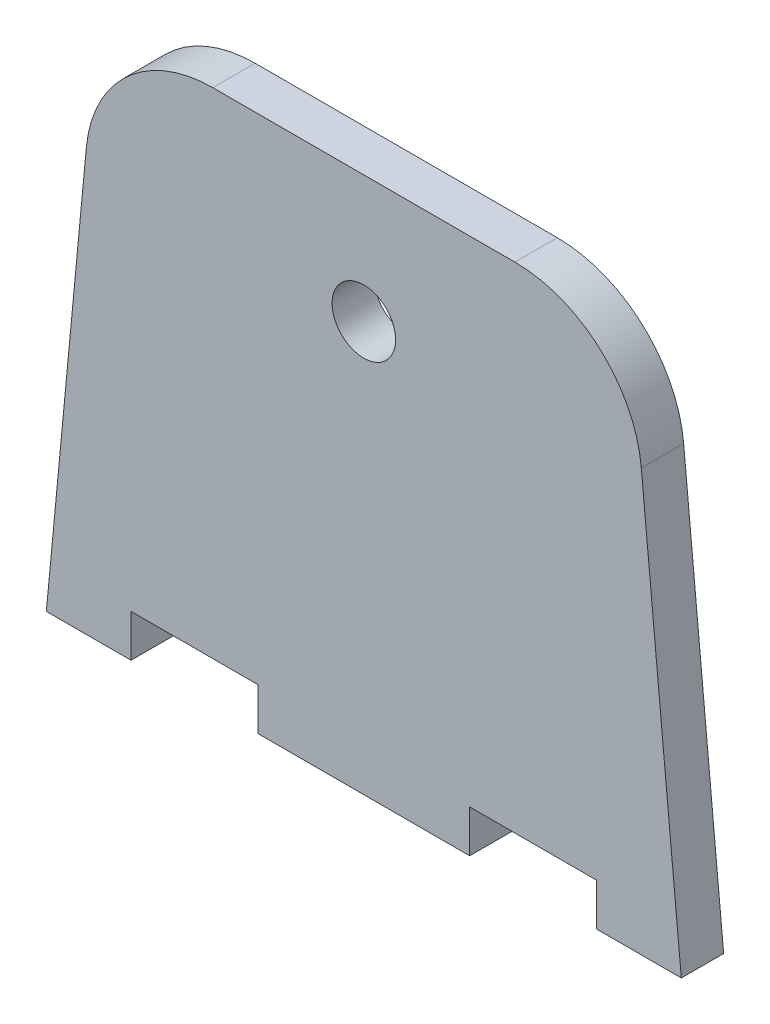
ISO-10303-21;
HEADER;
FILE_DESCRIPTION(('STEP AP214'),'2;1');
FILE_NAME('part.step','',(''),(''),'','','');
FILE_SCHEMA(('AUTOMOTIVE_DESIGN { 1 0 10303 214 1 1 1 1 }'));
ENDSEC;
DATA;
#1=APPLICATION_CONTEXT('core data for automotive mechanical design processes');
#2=APPLICATION_PROTOCOL_DEFINITION('international standard','automotive_design',2000,#1);
#3=PRODUCT_CONTEXT('',#1,'mechanical');
#4=PRODUCT('Part','Part','',(#3));
#5=PRODUCT_RELATED_PRODUCT_CATEGORY('part','',(#4));
#6=PRODUCT_DEFINITION_FORMATION('','',#4);
#7=PRODUCT_DEFINITION_CONTEXT('part definition',#1,'design');
#8=PRODUCT_DEFINITION('design','',#6,#7);
#9=PRODUCT_DEFINITION_SHAPE('','',#8);
#10=(LENGTH_UNIT() NAMED_UNIT(*) SI_UNIT(.MILLI.,.METRE.));
#11=(NAMED_UNIT(*) PLANE_ANGLE_UNIT() SI_UNIT($,.RADIAN.));
#12=(NAMED_UNIT(*) SI_UNIT($,.STERADIAN.) SOLID_ANGLE_UNIT());
#13=UNCERTAINTY_MEASURE_WITH_UNIT(LENGTH_MEASURE(1.E-05),#10,'distance_accuracy_value','');
#14=(GEOMETRIC_REPRESENTATION_CONTEXT(3) GLOBAL_UNCERTAINTY_ASSIGNED_CONTEXT((#13)) GLOBAL_UNIT_ASSIGNED_CONTEXT((#10,
#11,#12)) REPRESENTATION_CONTEXT('',''));
#15=CARTESIAN_POINT('',(0.,0.,0.));
#16=DIRECTION('',(0.,0.,1.));
#17=DIRECTION('',(1.,0.,0.));
#18=AXIS2_PLACEMENT_3D('',#15,#16,#17);
#19=CARTESIAN_POINT('',(0.,0.,3.175));
#20=DIRECTION('',(0.,1.,0.));
#21=DIRECTION('',(0.,0.,1.));
#22=AXIS2_PLACEMENT_3D('',#19,#20,#21);
#23=PLANE('',#22);
#24=DIRECTION('',(1.,0.,0.));
#25=VECTOR('',#24,1.);
#26=CARTESIAN_POINT('',(0.,0.,3.175));
#27=LINE('',#26,#25);
#28=CARTESIAN_POINT('',(17.4625,0.,3.175));
#29=VERTEX_POINT('',#28);
#30=CARTESIAN_POINT('',(23.8125,0.,3.175));
#31=VERTEX_POINT('',#30);
#32=EDGE_CURVE('E206',#29,#31,#27,.T.);
#33=ORIENTED_EDGE('',*,*,#32,.F.);
#34=DIRECTION('',(0.,0.,1.));
#35=VECTOR('',#34,1.);
#36=CARTESIAN_POINT('',(17.4625,0.,0.));
#37=LINE('',#36,#35);
#38=CARTESIAN_POINT('',(17.4625,0.,0.));
#39=VERTEX_POINT('',#38);
#40=EDGE_CURVE('E163',#39,#29,#37,.T.);
#41=ORIENTED_EDGE('',*,*,#40,.F.);
#42=DIRECTION('',(1.,0.,0.));
#43=VECTOR('',#42,1.);
#44=CARTESIAN_POINT('',(0.,0.,0.));
#45=LINE('',#44,#43);
#46=CARTESIAN_POINT('',(23.8125,0.,0.));
#47=VERTEX_POINT('',#46);
#48=EDGE_CURVE('E154',#39,#47,#45,.T.);
#49=ORIENTED_EDGE('',*,*,#48,.T.);
#50=DIRECTION('',(0.,0.,-1.));
#51=VECTOR('',#50,1.);
#52=CARTESIAN_POINT('',(23.8125,0.,3.175));
#53=LINE('',#52,#51);
#54=EDGE_CURVE('E240',#31,#47,#53,.T.);
#55=ORIENTED_EDGE('',*,*,#54,.F.);
#56=EDGE_LOOP('',(#33,#41,#49,#55));
#57=FACE_BOUND('',#56,.T.);
#58=ADVANCED_FACE('F33',(#57),#23,.F.);
#59=CARTESIAN_POINT('',(-23.8125,0.,0.));
#60=VERTEX_POINT('',#59);
#61=CARTESIAN_POINT('',(-17.4625,0.,0.));
#62=VERTEX_POINT('',#61);
#63=EDGE_CURVE('E228',#60,#62,#45,.T.);
#64=ORIENTED_EDGE('',*,*,#63,.T.);
#65=DIRECTION('',(0.,0.,1.));
#66=VECTOR('',#65,1.);
#67=CARTESIAN_POINT('',(-17.4625,0.,0.));
#68=LINE('',#67,#66);
#69=CARTESIAN_POINT('',(-17.4625,0.,3.175));
#70=VERTEX_POINT('',#69);
#71=EDGE_CURVE('E178',#62,#70,#68,.T.);
#72=ORIENTED_EDGE('',*,*,#71,.T.);
#73=CARTESIAN_POINT('',(-23.8125,0.,3.175));
#74=VERTEX_POINT('',#73);
#75=EDGE_CURVE('E207',#74,#70,#27,.T.);
#76=ORIENTED_EDGE('',*,*,#75,.F.);
#77=DIRECTION('',(0.,0.,-1.));
#78=VECTOR('',#77,1.);
#79=CARTESIAN_POINT('',(-23.8125,0.,3.175));
#80=LINE('',#79,#78);
#81=EDGE_CURVE('E243',#74,#60,#80,.T.);
#82=ORIENTED_EDGE('',*,*,#81,.T.);
#83=EDGE_LOOP('',(#64,#72,#76,#82));
#84=FACE_BOUND('',#83,.T.);
#85=ADVANCED_FACE('F257',(#84),#23,.F.);
#86=CARTESIAN_POINT('',(0.,40.259,3.175));
#87=DIRECTION('',(0.,1.,0.));
#88=DIRECTION('',(-1.,0.,0.));
#89=AXIS2_PLACEMENT_3D('',#86,#87,#88);
#90=PLANE('',#89);
#91=DIRECTION('',(1.,0.,0.));
#92=VECTOR('',#91,1.);
#93=CARTESIAN_POINT('',(0.,40.259,0.));
#94=LINE('',#93,#92);
#95=CARTESIAN_POINT('',(-11.3303391189838,40.259,0.));
#96=VERTEX_POINT('',#95);
#97=CARTESIAN_POINT('',(11.3303391189838,40.259,0.));
#98=VERTEX_POINT('',#97);
#99=EDGE_CURVE('E219',#96,#98,#94,.T.);
#100=ORIENTED_EDGE('',*,*,#99,.F.);
#101=DIRECTION('',(0.,0.,-1.));
#102=VECTOR('',#101,1.);
#103=CARTESIAN_POINT('',(-11.3303391189838,40.259,3.175));
#104=LINE('',#103,#102);
#105=CARTESIAN_POINT('',(-11.3303391189838,40.259,3.175));
#106=VERTEX_POINT('',#105);
#107=EDGE_CURVE('E11',#106,#96,#104,.T.);
#108=ORIENTED_EDGE('',*,*,#107,.F.);
#109=DIRECTION('',(1.,0.,0.));
#110=VECTOR('',#109,1.);
#111=CARTESIAN_POINT('',(0.,40.259,3.175));
#112=LINE('',#111,#110);
#113=CARTESIAN_POINT('',(11.3303391189838,40.259,3.175));
#114=VERTEX_POINT('',#113);
#115=EDGE_CURVE('E197',#106,#114,#112,.T.);
#116=ORIENTED_EDGE('',*,*,#115,.T.);
#117=DIRECTION('',(0.,0.,-1.));
#118=VECTOR('',#117,1.);
#119=CARTESIAN_POINT('',(11.3303391189838,40.259,3.175));
#120=LINE('',#119,#118);
#121=EDGE_CURVE('E216',#114,#98,#120,.T.);
#122=ORIENTED_EDGE('',*,*,#121,.T.);
#123=EDGE_LOOP('',(#100,#108,#116,#122));
#124=FACE_BOUND('',#123,.T.);
#125=ADVANCED_FACE('F266',(#124),#90,.T.);
#126=CARTESIAN_POINT('',(-11.3303391189839,30.734,3.175));
#127=DIRECTION('',(0.,0.,-1.));
#128=DIRECTION('',(-1.,0.,0.));
#129=AXIS2_PLACEMENT_3D('',#126,#127,#128);
#130=CYLINDRICAL_SURFACE('',#129,9.525);
#131=CARTESIAN_POINT('',(-11.3303391189839,30.734,0.));
#132=DIRECTION('',(0.,0.,1.));
#133=DIRECTION('',(1.,0.,0.));
#134=AXIS2_PLACEMENT_3D('',#131,#132,#133);
#135=CIRCLE('',#134,9.525);
#136=CARTESIAN_POINT('',(-20.8128001055754,31.6331988866595,0.));
#137=VERTEX_POINT('',#136);
#138=EDGE_CURVE('E222',#96,#137,#135,.T.);
#139=ORIENTED_EDGE('',*,*,#138,.T.);
#140=DIRECTION('',(0.,0.,-1.));
#141=VECTOR('',#140,1.);
#142=CARTESIAN_POINT('',(-20.8128001055754,31.6331988866595,3.175));
#143=LINE('',#142,#141);
#144=CARTESIAN_POINT('',(-20.8128001055754,31.6331988866595,3.175));
#145=VERTEX_POINT('',#144);
#146=EDGE_CURVE('E41',#145,#137,#143,.T.);
#147=ORIENTED_EDGE('',*,*,#146,.F.);
#148=CARTESIAN_POINT('',(-11.3303391189839,30.734,3.175));
#149=DIRECTION('',(0.,0.,1.));
#150=DIRECTION('',(1.,0.,0.));
#151=AXIS2_PLACEMENT_3D('',#148,#149,#150);
#152=CIRCLE('',#151,9.525);
#153=EDGE_CURVE('E201',#106,#145,#152,.T.);
#154=ORIENTED_EDGE('',*,*,#153,.F.);
#155=ORIENTED_EDGE('',*,*,#107,.T.);
#156=EDGE_LOOP('',(#139,#147,#154,#155));
#157=FACE_BOUND('',#156,.T.);
#158=ADVANCED_FACE('F252',(#157),#130,.T.);
#159=CARTESIAN_POINT('',(-23.6002798850998,2.23795757531119,3.175));
#160=DIRECTION('',(-0.995533961846879,0.094404082588928,0.));
#161=DIRECTION('',(-0.0944040825889281,-0.995533961846879,0.));
#162=AXIS2_PLACEMENT_3D('',#159,#160,#161);
#163=PLANE('',#162);
#164=DIRECTION('',(0.0944040825889281,0.995533961846879,0.));
#165=VECTOR('',#164,1.);
#166=CARTESIAN_POINT('',(-23.6002798850998,2.23795757531119,0.));
#167=LINE('',#166,#165);
#168=EDGE_CURVE('E225',#60,#137,#167,.T.);
#169=ORIENTED_EDGE('',*,*,#168,.F.);
#170=ORIENTED_EDGE('',*,*,#81,.F.);
#171=DIRECTION('',(0.0944040825889281,0.995533961846879,0.));
#172=VECTOR('',#171,1.);
#173=CARTESIAN_POINT('',(-23.6002798850998,2.23795757531119,3.175));
#174=LINE('',#173,#172);
#175=EDGE_CURVE('E203',#74,#145,#174,.T.);
#176=ORIENTED_EDGE('',*,*,#175,.T.);
#177=ORIENTED_EDGE('',*,*,#146,.T.);
#178=EDGE_LOOP('',(#169,#170,#176,#177));
#179=FACE_BOUND('',#178,.T.);
#180=ADVANCED_FACE('F247',(#179),#163,.T.);
#181=CARTESIAN_POINT('',(-7.9375,0.,0.));
#182=VERTEX_POINT('',#181);
#183=CARTESIAN_POINT('',(7.9375,0.,0.));
#184=VERTEX_POINT('',#183);
#185=EDGE_CURVE('E232',#182,#184,#45,.T.);
#186=ORIENTED_EDGE('',*,*,#185,.T.);
#187=DIRECTION('',(0.,0.,1.));
#188=VECTOR('',#187,1.);
#189=CARTESIAN_POINT('',(7.9375,0.,0.));
#190=LINE('',#189,#188);
#191=CARTESIAN_POINT('',(7.9375,0.,3.175));
#192=VERTEX_POINT('',#191);
#193=EDGE_CURVE('E166',#184,#192,#190,.T.);
#194=ORIENTED_EDGE('',*,*,#193,.T.);
#195=CARTESIAN_POINT('',(-7.9375,0.,3.175));
#196=VERTEX_POINT('',#195);
#197=EDGE_CURVE('E211',#196,#192,#27,.T.);
#198=ORIENTED_EDGE('',*,*,#197,.F.);
#199=DIRECTION('',(0.,0.,1.));
#200=VECTOR('',#199,1.);
#201=CARTESIAN_POINT('',(-7.9375,0.,0.));
#202=LINE('',#201,#200);
#203=EDGE_CURVE('E190',#182,#196,#202,.T.);
#204=ORIENTED_EDGE('',*,*,#203,.F.);
#205=EDGE_LOOP('',(#186,#194,#198,#204));
#206=FACE_BOUND('',#205,.T.);
#207=ADVANCED_FACE('F281',(#206),#23,.F.);
#208=CARTESIAN_POINT('',(23.6002798850998,2.23795757531119,3.175));
#209=DIRECTION('',(-0.995533961846879,-0.0944040825889283,0.));
#210=DIRECTION('',(0.0944040825889283,-0.995533961846879,0.));
#211=AXIS2_PLACEMENT_3D('',#208,#209,#210);
#212=PLANE('',#211);
#213=DIRECTION('',(-0.0944040825889283,0.995533961846879,0.));
#214=VECTOR('',#213,1.);
#215=CARTESIAN_POINT('',(23.6002798850998,2.23795757531119,0.));
#216=LINE('',#215,#214);
#217=CARTESIAN_POINT('',(20.8128001055754,31.6331988866595,0.));
#218=VERTEX_POINT('',#217);
#219=EDGE_CURVE('E231',#47,#218,#216,.T.);
#220=ORIENTED_EDGE('',*,*,#219,.T.);
#221=DIRECTION('',(0.,0.,-1.));
#222=VECTOR('',#221,1.);
#223=CARTESIAN_POINT('',(20.8128001055754,31.6331988866595,3.175));
#224=LINE('',#223,#222);
#225=CARTESIAN_POINT('',(20.8128001055754,31.6331988866595,3.175));
#226=VERTEX_POINT('',#225);
#227=EDGE_CURVE('E238',#226,#218,#224,.T.);
#228=ORIENTED_EDGE('',*,*,#227,.F.);
#229=DIRECTION('',(-0.0944040825889283,0.995533961846879,0.));
#230=VECTOR('',#229,1.);
#231=CARTESIAN_POINT('',(23.6002798850998,2.23795757531119,3.175));
#232=LINE('',#231,#230);
#233=EDGE_CURVE('E210',#31,#226,#232,.T.);
#234=ORIENTED_EDGE('',*,*,#233,.F.);
#235=ORIENTED_EDGE('',*,*,#54,.T.);
#236=EDGE_LOOP('',(#220,#228,#234,#235));
#237=FACE_BOUND('',#236,.T.);
#238=ADVANCED_FACE('F273',(#237),#212,.F.);
#239=CARTESIAN_POINT('',(0.,30.734,3.175));
#240=DIRECTION('',(0.,0.,-1.));
#241=DIRECTION('',(-1.,0.,0.));
#242=AXIS2_PLACEMENT_3D('',#239,#240,#241);
#243=CYLINDRICAL_SURFACE('',#242,2.38125);
#244=CARTESIAN_POINT('',(0.,30.734,3.175));
#245=DIRECTION('',(0.,0.,1.));
#246=DIRECTION('',(1.,0.,0.));
#247=AXIS2_PLACEMENT_3D('',#244,#245,#246);
#248=CIRCLE('',#247,2.38125);
#249=CARTESIAN_POINT('',(2.38125,30.734,3.175));
#250=VERTEX_POINT('',#249);
#251=EDGE_CURVE('E194',#250,#250,#248,.T.);
#252=ORIENTED_EDGE('',*,*,#251,.T.);
#253=EDGE_LOOP('',(#252));
#254=FACE_BOUND('',#253,.T.);
#255=CARTESIAN_POINT('',(0.,30.734,0.));
#256=DIRECTION('',(0.,0.,1.));
#257=DIRECTION('',(1.,0.,0.));
#258=AXIS2_PLACEMENT_3D('',#255,#256,#257);
#259=CIRCLE('',#258,2.38125);
#260=CARTESIAN_POINT('',(2.38125,30.734,0.));
#261=VERTEX_POINT('',#260);
#262=EDGE_CURVE('E187',#261,#261,#259,.T.);
#263=ORIENTED_EDGE('',*,*,#262,.F.);
#264=EDGE_LOOP('',(#263));
#265=FACE_BOUND('',#264,.T.);
#266=ADVANCED_FACE('F35',(#254,#265),#243,.F.);
#267=CARTESIAN_POINT('',(11.3303391189839,30.734,3.175));
#268=DIRECTION('',(0.,0.,-1.));
#269=DIRECTION('',(-1.,0.,0.));
#270=AXIS2_PLACEMENT_3D('',#267,#268,#269);
#271=CYLINDRICAL_SURFACE('',#270,9.525);
#272=CARTESIAN_POINT('',(11.3303391189839,30.734,0.));
#273=DIRECTION('',(0.,0.,1.));
#274=DIRECTION('',(1.,0.,0.));
#275=AXIS2_PLACEMENT_3D('',#272,#273,#274);
#276=CIRCLE('',#275,9.525);
#277=EDGE_CURVE('E198',#98,#218,#276,.F.);
#278=ORIENTED_EDGE('',*,*,#277,.F.);
#279=ORIENTED_EDGE('',*,*,#121,.F.);
#280=CARTESIAN_POINT('',(11.3303391189839,30.734,3.175));
#281=DIRECTION('',(0.,0.,1.));
#282=DIRECTION('',(1.,0.,0.));
#283=AXIS2_PLACEMENT_3D('',#280,#281,#282);
#284=CIRCLE('',#283,9.525);
#285=EDGE_CURVE('E213',#114,#226,#284,.F.);
#286=ORIENTED_EDGE('',*,*,#285,.T.);
#287=ORIENTED_EDGE('',*,*,#227,.T.);
#288=EDGE_LOOP('',(#278,#279,#286,#287));
#289=FACE_BOUND('',#288,.T.);
#290=ADVANCED_FACE('F269',(#289),#271,.T.);
#291=CARTESIAN_POINT('',(0.,0.,3.175));
#292=DIRECTION('',(0.,0.,1.));
#293=DIRECTION('',(1.,0.,0.));
#294=AXIS2_PLACEMENT_3D('',#291,#292,#293);
#295=PLANE('',#294);
#296=DIRECTION('',(0.,1.,0.));
#297=VECTOR('',#296,1.);
#298=CARTESIAN_POINT('',(17.4625,0.,3.175));
#299=LINE('',#298,#297);
#300=CARTESIAN_POINT('',(17.4625,3.175,3.175));
#301=VERTEX_POINT('',#300);
#302=EDGE_CURVE('E139',#29,#301,#299,.T.);
#303=ORIENTED_EDGE('',*,*,#302,.F.);
#304=ORIENTED_EDGE('',*,*,#32,.T.);
#305=ORIENTED_EDGE('',*,*,#233,.T.);
#306=ORIENTED_EDGE('',*,*,#285,.F.);
#307=ORIENTED_EDGE('',*,*,#115,.F.);
#308=ORIENTED_EDGE('',*,*,#153,.T.);
#309=ORIENTED_EDGE('',*,*,#175,.F.);
#310=ORIENTED_EDGE('',*,*,#75,.T.);
#311=DIRECTION('',(0.,-1.,0.));
#312=VECTOR('',#311,1.);
#313=CARTESIAN_POINT('',(-17.4625,0.,3.175));
#314=LINE('',#313,#312);
#315=CARTESIAN_POINT('',(-17.4625,3.175,3.175));
#316=VERTEX_POINT('',#315);
#317=EDGE_CURVE('E165',#316,#70,#314,.T.);
#318=ORIENTED_EDGE('',*,*,#317,.F.);
#319=DIRECTION('',(-1.,0.,0.));
#320=VECTOR('',#319,1.);
#321=CARTESIAN_POINT('',(-17.4625,3.175,3.175));
#322=LINE('',#321,#320);
#323=CARTESIAN_POINT('',(-7.9375,3.175,3.175));
#324=VERTEX_POINT('',#323);
#325=EDGE_CURVE('E174',#324,#316,#322,.T.);
#326=ORIENTED_EDGE('',*,*,#325,.F.);
#327=DIRECTION('',(0.,1.,0.));
#328=VECTOR('',#327,1.);
#329=CARTESIAN_POINT('',(-7.9375,0.,3.175));
#330=LINE('',#329,#328);
#331=EDGE_CURVE('E180',#196,#324,#330,.T.);
#332=ORIENTED_EDGE('',*,*,#331,.F.);
#333=ORIENTED_EDGE('',*,*,#197,.T.);
#334=DIRECTION('',(0.,-1.,0.));
#335=VECTOR('',#334,1.);
#336=CARTESIAN_POINT('',(7.9375,0.,3.175));
#337=LINE('',#336,#335);
#338=CARTESIAN_POINT('',(7.9375,3.175,3.175));
#339=VERTEX_POINT('',#338);
#340=EDGE_CURVE('E155',#339,#192,#337,.T.);
#341=ORIENTED_EDGE('',*,*,#340,.F.);
#342=DIRECTION('',(-1.,0.,0.));
#343=VECTOR('',#342,1.);
#344=CARTESIAN_POINT('',(17.4625,3.175,3.175));
#345=LINE('',#344,#343);
#346=EDGE_CURVE('E157',#301,#339,#345,.T.);
#347=ORIENTED_EDGE('',*,*,#346,.F.);
#348=EDGE_LOOP('',(#303,#304,#305,#306,#307,#308,#309,#310,#318,#326,#332,#333,#341,#347));
#349=FACE_BOUND('',#348,.T.);
#350=ORIENTED_EDGE('',*,*,#251,.F.);
#351=EDGE_LOOP('',(#350));
#352=FACE_BOUND('',#351,.T.);
#353=ADVANCED_FACE('F261',(#349,#352),#295,.T.);
#354=CARTESIAN_POINT('',(0.,0.,0.));
#355=DIRECTION('',(0.,0.,1.));
#356=DIRECTION('',(1.,0.,0.));
#357=AXIS2_PLACEMENT_3D('',#354,#355,#356);
#358=PLANE('',#357);
#359=ORIENTED_EDGE('',*,*,#48,.F.);
#360=DIRECTION('',(0.,1.,0.));
#361=VECTOR('',#360,1.);
#362=CARTESIAN_POINT('',(17.4625,0.,0.));
#363=LINE('',#362,#361);
#364=CARTESIAN_POINT('',(17.4625,3.175,0.));
#365=VERTEX_POINT('',#364);
#366=EDGE_CURVE('E136',#39,#365,#363,.T.);
#367=ORIENTED_EDGE('',*,*,#366,.T.);
#368=DIRECTION('',(-1.,0.,0.));
#369=VECTOR('',#368,1.);
#370=CARTESIAN_POINT('',(17.4625,3.175,0.));
#371=LINE('',#370,#369);
#372=CARTESIAN_POINT('',(7.9375,3.175,0.));
#373=VERTEX_POINT('',#372);
#374=EDGE_CURVE('E146',#365,#373,#371,.T.);
#375=ORIENTED_EDGE('',*,*,#374,.T.);
#376=DIRECTION('',(0.,-1.,0.));
#377=VECTOR('',#376,1.);
#378=CARTESIAN_POINT('',(7.9375,0.,0.));
#379=LINE('',#378,#377);
#380=EDGE_CURVE('E48',#373,#184,#379,.T.);
#381=ORIENTED_EDGE('',*,*,#380,.T.);
#382=ORIENTED_EDGE('',*,*,#185,.F.);
#383=DIRECTION('',(0.,1.,0.));
#384=VECTOR('',#383,1.);
#385=CARTESIAN_POINT('',(-7.9375,0.,0.));
#386=LINE('',#385,#384);
#387=CARTESIAN_POINT('',(-7.9375,3.175,0.));
#388=VERTEX_POINT('',#387);
#389=EDGE_CURVE('E173',#182,#388,#386,.T.);
#390=ORIENTED_EDGE('',*,*,#389,.T.);
#391=DIRECTION('',(-1.,0.,0.));
#392=VECTOR('',#391,1.);
#393=CARTESIAN_POINT('',(-17.4625,3.175,0.));
#394=LINE('',#393,#392);
#395=CARTESIAN_POINT('',(-17.4625,3.175,0.));
#396=VERTEX_POINT('',#395);
#397=EDGE_CURVE('E56',#388,#396,#394,.T.);
#398=ORIENTED_EDGE('',*,*,#397,.T.);
#399=DIRECTION('',(0.,-1.,0.));
#400=VECTOR('',#399,1.);
#401=CARTESIAN_POINT('',(-17.4625,0.,0.));
#402=LINE('',#401,#400);
#403=EDGE_CURVE('E170',#396,#62,#402,.T.);
#404=ORIENTED_EDGE('',*,*,#403,.T.);
#405=ORIENTED_EDGE('',*,*,#63,.F.);
#406=ORIENTED_EDGE('',*,*,#168,.T.);
#407=ORIENTED_EDGE('',*,*,#138,.F.);
#408=ORIENTED_EDGE('',*,*,#99,.T.);
#409=ORIENTED_EDGE('',*,*,#277,.T.);
#410=ORIENTED_EDGE('',*,*,#219,.F.);
#411=EDGE_LOOP('',(#359,#367,#375,#381,#382,#390,#398,#404,#405,#406,#407,#408,#409,#410));
#412=FACE_BOUND('',#411,.T.);
#413=ORIENTED_EDGE('',*,*,#262,.T.);
#414=EDGE_LOOP('',(#413));
#415=FACE_BOUND('',#414,.T.);
#416=ADVANCED_FACE('F151',(#412,#415),#358,.F.);
#417=CARTESIAN_POINT('',(-17.4625,0.,0.));
#418=DIRECTION('',(-1.,0.,0.));
#419=DIRECTION('',(0.,0.,1.));
#420=AXIS2_PLACEMENT_3D('',#417,#418,#419);
#421=PLANE('',#420);
#422=ORIENTED_EDGE('',*,*,#317,.T.);
#423=ORIENTED_EDGE('',*,*,#71,.F.);
#424=ORIENTED_EDGE('',*,*,#403,.F.);
#425=DIRECTION('',(0.,0.,1.));
#426=VECTOR('',#425,1.);
#427=CARTESIAN_POINT('',(-17.4625,3.175,0.));
#428=LINE('',#427,#426);
#429=EDGE_CURVE('E185',#396,#316,#428,.T.);
#430=ORIENTED_EDGE('',*,*,#429,.T.);
#431=EDGE_LOOP('',(#422,#423,#424,#430));
#432=FACE_BOUND('',#431,.T.);
#433=ADVANCED_FACE('F290',(#432),#421,.F.);
#434=CARTESIAN_POINT('',(-17.4625,3.175,0.));
#435=DIRECTION('',(0.,1.,0.));
#436=DIRECTION('',(0.,0.,1.));
#437=AXIS2_PLACEMENT_3D('',#434,#435,#436);
#438=PLANE('',#437);
#439=ORIENTED_EDGE('',*,*,#325,.T.);
#440=ORIENTED_EDGE('',*,*,#429,.F.);
#441=ORIENTED_EDGE('',*,*,#397,.F.);
#442=DIRECTION('',(0.,0.,1.));
#443=VECTOR('',#442,1.);
#444=CARTESIAN_POINT('',(-7.9375,3.175,0.));
#445=LINE('',#444,#443);
#446=EDGE_CURVE('E188',#388,#324,#445,.T.);
#447=ORIENTED_EDGE('',*,*,#446,.T.);
#448=EDGE_LOOP('',(#439,#440,#441,#447));
#449=FACE_BOUND('',#448,.T.);
#450=ADVANCED_FACE('F288',(#449),#438,.F.);
#451=CARTESIAN_POINT('',(-7.9375,0.,0.));
#452=DIRECTION('',(1.,0.,0.));
#453=DIRECTION('',(0.,0.,-1.));
#454=AXIS2_PLACEMENT_3D('',#451,#452,#453);
#455=PLANE('',#454);
#456=ORIENTED_EDGE('',*,*,#331,.T.);
#457=ORIENTED_EDGE('',*,*,#446,.F.);
#458=ORIENTED_EDGE('',*,*,#389,.F.);
#459=ORIENTED_EDGE('',*,*,#203,.T.);
#460=EDGE_LOOP('',(#456,#457,#458,#459));
#461=FACE_BOUND('',#460,.T.);
#462=ADVANCED_FACE('F285',(#461),#455,.F.);
#463=CARTESIAN_POINT('',(17.4625,0.,0.));
#464=DIRECTION('',(1.,0.,0.));
#465=DIRECTION('',(0.,0.,-1.));
#466=AXIS2_PLACEMENT_3D('',#463,#464,#465);
#467=PLANE('',#466);
#468=ORIENTED_EDGE('',*,*,#302,.T.);
#469=DIRECTION('',(0.,0.,1.));
#470=VECTOR('',#469,1.);
#471=CARTESIAN_POINT('',(17.4625,3.175,0.));
#472=LINE('',#471,#470);
#473=EDGE_CURVE('E132',#365,#301,#472,.T.);
#474=ORIENTED_EDGE('',*,*,#473,.F.);
#475=ORIENTED_EDGE('',*,*,#366,.F.);
#476=ORIENTED_EDGE('',*,*,#40,.T.);
#477=EDGE_LOOP('',(#468,#474,#475,#476));
#478=FACE_BOUND('',#477,.T.);
#479=ADVANCED_FACE('F134',(#478),#467,.F.);
#480=CARTESIAN_POINT('',(7.9375,0.,0.));
#481=DIRECTION('',(-1.,0.,0.));
#482=DIRECTION('',(0.,0.,1.));
#483=AXIS2_PLACEMENT_3D('',#480,#481,#482);
#484=PLANE('',#483);
#485=ORIENTED_EDGE('',*,*,#340,.T.);
#486=ORIENTED_EDGE('',*,*,#193,.F.);
#487=ORIENTED_EDGE('',*,*,#380,.F.);
#488=DIRECTION('',(0.,0.,1.));
#489=VECTOR('',#488,1.);
#490=CARTESIAN_POINT('',(7.9375,3.175,0.));
#491=LINE('',#490,#489);
#492=EDGE_CURVE('E143',#373,#339,#491,.T.);
#493=ORIENTED_EDGE('',*,*,#492,.T.);
#494=EDGE_LOOP('',(#485,#486,#487,#493));
#495=FACE_BOUND('',#494,.T.);
#496=ADVANCED_FACE('F398',(#495),#484,.F.);
#497=CARTESIAN_POINT('',(17.4625,3.175,0.));
#498=DIRECTION('',(0.,1.,0.));
#499=DIRECTION('',(-1.,0.,0.));
#500=AXIS2_PLACEMENT_3D('',#497,#498,#499);
#501=PLANE('',#500);
#502=ORIENTED_EDGE('',*,*,#346,.T.);
#503=ORIENTED_EDGE('',*,*,#492,.F.);
#504=ORIENTED_EDGE('',*,*,#374,.F.);
#505=ORIENTED_EDGE('',*,*,#473,.T.);
#506=EDGE_LOOP('',(#502,#503,#504,#505));
#507=FACE_BOUND('',#506,.T.);
#508=ADVANCED_FACE('F147',(#507),#501,.F.);
#509=CLOSED_SHELL('',(#58,#85,#125,#158,#180,#207,#238,#266,#290,#353,#416,#433,#450,#462,#479,
#496,#508));
#510=MANIFOLD_SOLID_BREP('B2',#509);
#511=ADVANCED_BREP_SHAPE_REPRESENTATION('',(#18,#510),#14);
#512=SHAPE_DEFINITION_REPRESENTATION(#9,#511);
ENDSEC;
END-ISO-10303-21;
